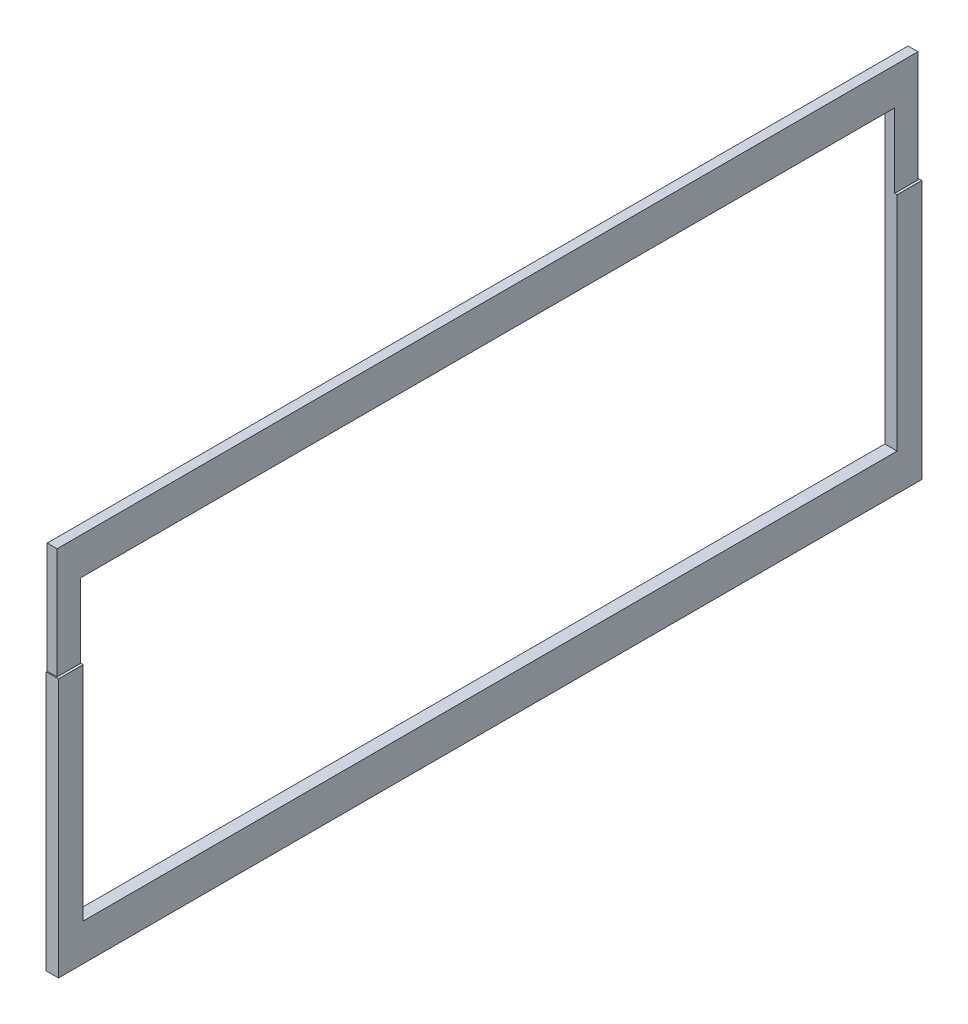
ISO-10303-21;
HEADER;
FILE_DESCRIPTION(('STEP AP214'),'2;1');
FILE_NAME('part.step','',(''),(''),'','','');
FILE_SCHEMA(('AUTOMOTIVE_DESIGN { 1 0 10303 214 1 1 1 1 }'));
ENDSEC;
DATA;
#1=APPLICATION_CONTEXT('core data for automotive mechanical design processes');
#2=APPLICATION_PROTOCOL_DEFINITION('international standard','automotive_design',2000,#1);
#3=PRODUCT_CONTEXT('',#1,'mechanical');
#4=PRODUCT('Part','Part','',(#3));
#5=PRODUCT_RELATED_PRODUCT_CATEGORY('part','',(#4));
#6=PRODUCT_DEFINITION_FORMATION('','',#4);
#7=PRODUCT_DEFINITION_CONTEXT('part definition',#1,'design');
#8=PRODUCT_DEFINITION('design','',#6,#7);
#9=PRODUCT_DEFINITION_SHAPE('','',#8);
#10=(LENGTH_UNIT() NAMED_UNIT(*) SI_UNIT(.MILLI.,.METRE.));
#11=(NAMED_UNIT(*) PLANE_ANGLE_UNIT() SI_UNIT($,.RADIAN.));
#12=(NAMED_UNIT(*) SI_UNIT($,.STERADIAN.) SOLID_ANGLE_UNIT());
#13=UNCERTAINTY_MEASURE_WITH_UNIT(LENGTH_MEASURE(1.E-05),#10,'distance_accuracy_value','');
#14=(GEOMETRIC_REPRESENTATION_CONTEXT(3) GLOBAL_UNCERTAINTY_ASSIGNED_CONTEXT((#13)) GLOBAL_UNIT_ASSIGNED_CONTEXT((#10,
#11,#12)) REPRESENTATION_CONTEXT('',''));
#15=CARTESIAN_POINT('',(0.,0.,0.));
#16=DIRECTION('',(0.,0.,1.));
#17=DIRECTION('',(1.,0.,0.));
#18=AXIS2_PLACEMENT_3D('',#15,#16,#17);
#19=CARTESIAN_POINT('',(10.,-45.,0.));
#20=DIRECTION('',(0.,1.,0.));
#21=DIRECTION('',(0.,0.,1.));
#22=AXIS2_PLACEMENT_3D('',#19,#20,#21);
#23=PLANE('',#22);
#24=DIRECTION('',(1.,0.,0.));
#25=VECTOR('',#24,1.);
#26=CARTESIAN_POINT('',(10.,-45.,329.868447372236));
#27=LINE('',#26,#25);
#28=CARTESIAN_POINT('',(8.,-45.,329.868447372236));
#29=VERTEX_POINT('',#28);
#30=CARTESIAN_POINT('',(10.,-45.,329.868447372236));
#31=VERTEX_POINT('',#30);
#32=EDGE_CURVE('E173',#29,#31,#27,.T.);
#33=ORIENTED_EDGE('',*,*,#32,.F.);
#34=DIRECTION('',(0.,0.,-1.));
#35=VECTOR('',#34,1.);
#36=CARTESIAN_POINT('',(8.,-45.,0.));
#37=LINE('',#36,#35);
#38=CARTESIAN_POINT('',(8.,-45.,349.));
#39=VERTEX_POINT('',#38);
#40=EDGE_CURVE('E176',#39,#29,#37,.T.);
#41=ORIENTED_EDGE('',*,*,#40,.F.);
#42=DIRECTION('',(-1.,0.,0.));
#43=VECTOR('',#42,1.);
#44=CARTESIAN_POINT('',(8.,-45.,349.));
#45=LINE('',#44,#43);
#46=CARTESIAN_POINT('',(0.,-45.,349.));
#47=VERTEX_POINT('',#46);
#48=EDGE_CURVE('E188',#39,#47,#45,.T.);
#49=ORIENTED_EDGE('',*,*,#48,.T.);
#50=DIRECTION('',(0.,0.,-1.));
#51=VECTOR('',#50,1.);
#52=CARTESIAN_POINT('',(0.,-45.,0.));
#53=LINE('',#52,#51);
#54=CARTESIAN_POINT('',(0.,-45.,349.868447372235));
#55=VERTEX_POINT('',#54);
#56=EDGE_CURVE('E239',#55,#47,#53,.T.);
#57=ORIENTED_EDGE('',*,*,#56,.F.);
#58=DIRECTION('',(-1.,0.,0.));
#59=VECTOR('',#58,1.);
#60=CARTESIAN_POINT('',(10.,-45.,349.868447372235));
#61=LINE('',#60,#59);
#62=CARTESIAN_POINT('',(10.,-45.,349.868447372235));
#63=VERTEX_POINT('',#62);
#64=EDGE_CURVE('E262',#63,#55,#61,.T.);
#65=ORIENTED_EDGE('',*,*,#64,.F.);
#66=DIRECTION('',(0.,0.,-1.));
#67=VECTOR('',#66,1.);
#68=CARTESIAN_POINT('',(10.,-45.,0.));
#69=LINE('',#68,#67);
#70=EDGE_CURVE('E230',#63,#31,#69,.T.);
#71=ORIENTED_EDGE('',*,*,#70,.T.);
#72=EDGE_LOOP('',(#33,#41,#49,#57,#65,#71));
#73=FACE_BOUND('',#72,.T.);
#74=ADVANCED_FACE('F33',(#73),#23,.T.);
#75=CARTESIAN_POINT('',(10.,-255.,0.));
#76=DIRECTION('',(0.,1.,0.));
#77=DIRECTION('',(0.,0.,1.));
#78=AXIS2_PLACEMENT_3D('',#75,#76,#77);
#79=PLANE('',#78);
#80=DIRECTION('',(0.,0.,-1.));
#81=VECTOR('',#80,1.);
#82=CARTESIAN_POINT('',(0.,-255.,0.));
#83=LINE('',#82,#81);
#84=CARTESIAN_POINT('',(0.,-255.,349.868447372235));
#85=VERTEX_POINT('',#84);
#86=CARTESIAN_POINT('',(0.,-255.,-350.131552627764));
#87=VERTEX_POINT('',#86);
#88=EDGE_CURVE('E210',#85,#87,#83,.T.);
#89=ORIENTED_EDGE('',*,*,#88,.T.);
#90=DIRECTION('',(-1.,0.,0.));
#91=VECTOR('',#90,1.);
#92=CARTESIAN_POINT('',(10.,-255.,-350.131552627764));
#93=LINE('',#92,#91);
#94=CARTESIAN_POINT('',(10.,-255.,-350.131552627764));
#95=VERTEX_POINT('',#94);
#96=EDGE_CURVE('E215',#95,#87,#93,.T.);
#97=ORIENTED_EDGE('',*,*,#96,.F.);
#98=DIRECTION('',(0.,0.,-1.));
#99=VECTOR('',#98,1.);
#100=CARTESIAN_POINT('',(10.,-255.,0.));
#101=LINE('',#100,#99);
#102=CARTESIAN_POINT('',(10.,-255.,349.868447372235));
#103=VERTEX_POINT('',#102);
#104=EDGE_CURVE('E248',#103,#95,#101,.T.);
#105=ORIENTED_EDGE('',*,*,#104,.F.);
#106=DIRECTION('',(-1.,0.,0.));
#107=VECTOR('',#106,1.);
#108=CARTESIAN_POINT('',(10.,-255.,349.868447372235));
#109=LINE('',#108,#107);
#110=EDGE_CURVE('E260',#103,#85,#109,.T.);
#111=ORIENTED_EDGE('',*,*,#110,.T.);
#112=EDGE_LOOP('',(#89,#97,#105,#111));
#113=FACE_BOUND('',#112,.T.);
#114=ADVANCED_FACE('F35',(#113),#79,.F.);
#115=CARTESIAN_POINT('',(10.,0.,-350.131552627764));
#116=DIRECTION('',(0.,0.,1.));
#117=DIRECTION('',(1.,0.,0.));
#118=AXIS2_PLACEMENT_3D('',#115,#116,#117);
#119=PLANE('',#118);
#120=DIRECTION('',(0.,1.,0.));
#121=VECTOR('',#120,1.);
#122=CARTESIAN_POINT('',(0.,0.,-350.131552627764));
#123=LINE('',#122,#121);
#124=CARTESIAN_POINT('',(0.,-45.,-350.131552627764));
#125=VERTEX_POINT('',#124);
#126=EDGE_CURVE('E250',#87,#125,#123,.T.);
#127=ORIENTED_EDGE('',*,*,#126,.T.);
#128=DIRECTION('',(-1.,0.,0.));
#129=VECTOR('',#128,1.);
#130=CARTESIAN_POINT('',(10.,-45.,-350.131552627764));
#131=LINE('',#130,#129);
#132=CARTESIAN_POINT('',(10.,-45.,-350.131552627764));
#133=VERTEX_POINT('',#132);
#134=EDGE_CURVE('E264',#133,#125,#131,.T.);
#135=ORIENTED_EDGE('',*,*,#134,.F.);
#136=DIRECTION('',(0.,1.,0.));
#137=VECTOR('',#136,1.);
#138=CARTESIAN_POINT('',(10.,0.,-350.131552627764));
#139=LINE('',#138,#137);
#140=EDGE_CURVE('E275',#95,#133,#139,.T.);
#141=ORIENTED_EDGE('',*,*,#140,.F.);
#142=ORIENTED_EDGE('',*,*,#96,.T.);
#143=EDGE_LOOP('',(#127,#135,#141,#142));
#144=FACE_BOUND('',#143,.T.);
#145=ADVANCED_FACE('F274',(#144),#119,.F.);
#146=DIRECTION('',(-1.,0.,0.));
#147=VECTOR('',#146,1.);
#148=CARTESIAN_POINT('',(10.,-45.,-330.131552627764));
#149=LINE('',#148,#147);
#150=CARTESIAN_POINT('',(10.,-45.,-330.131552627764));
#151=VERTEX_POINT('',#150);
#152=CARTESIAN_POINT('',(8.,-45.,-330.131552627764));
#153=VERTEX_POINT('',#152);
#154=EDGE_CURVE('E168',#151,#153,#149,.T.);
#155=ORIENTED_EDGE('',*,*,#154,.F.);
#156=EDGE_CURVE('E157',#151,#133,#69,.T.);
#157=ORIENTED_EDGE('',*,*,#156,.T.);
#158=ORIENTED_EDGE('',*,*,#134,.T.);
#159=CARTESIAN_POINT('',(0.,-45.,-349.));
#160=VERTEX_POINT('',#159);
#161=EDGE_CURVE('E246',#160,#125,#53,.T.);
#162=ORIENTED_EDGE('',*,*,#161,.F.);
#163=DIRECTION('',(-1.,0.,0.));
#164=VECTOR('',#163,1.);
#165=CARTESIAN_POINT('',(8.,-45.,-349.));
#166=LINE('',#165,#164);
#167=CARTESIAN_POINT('',(8.,-45.,-349.));
#168=VERTEX_POINT('',#167);
#169=EDGE_CURVE('E207',#168,#160,#166,.T.);
#170=ORIENTED_EDGE('',*,*,#169,.F.);
#171=EDGE_CURVE('E180',#153,#168,#37,.T.);
#172=ORIENTED_EDGE('',*,*,#171,.F.);
#173=EDGE_LOOP('',(#155,#157,#158,#162,#170,#172));
#174=FACE_BOUND('',#173,.T.);
#175=ADVANCED_FACE('F291',(#174),#23,.T.);
#176=CARTESIAN_POINT('',(10.,0.,349.868447372235));
#177=DIRECTION('',(0.,0.,1.));
#178=DIRECTION('',(1.,0.,0.));
#179=AXIS2_PLACEMENT_3D('',#176,#177,#178);
#180=PLANE('',#179);
#181=DIRECTION('',(0.,1.,0.));
#182=VECTOR('',#181,1.);
#183=CARTESIAN_POINT('',(0.,0.,349.868447372235));
#184=LINE('',#183,#182);
#185=EDGE_CURVE('E245',#85,#55,#184,.T.);
#186=ORIENTED_EDGE('',*,*,#185,.F.);
#187=ORIENTED_EDGE('',*,*,#110,.F.);
#188=DIRECTION('',(0.,1.,0.));
#189=VECTOR('',#188,1.);
#190=CARTESIAN_POINT('',(10.,0.,349.868447372235));
#191=LINE('',#190,#189);
#192=EDGE_CURVE('E263',#103,#63,#191,.T.);
#193=ORIENTED_EDGE('',*,*,#192,.T.);
#194=ORIENTED_EDGE('',*,*,#64,.T.);
#195=EDGE_LOOP('',(#186,#187,#193,#194));
#196=FACE_BOUND('',#195,.T.);
#197=ADVANCED_FACE('F294',(#196),#180,.T.);
#198=CARTESIAN_POINT('',(10.,0.,0.));
#199=DIRECTION('',(1.,0.,0.));
#200=DIRECTION('',(0.,0.,-1.));
#201=AXIS2_PLACEMENT_3D('',#198,#199,#200);
#202=PLANE('',#201);
#203=DIRECTION('',(0.,1.,0.));
#204=VECTOR('',#203,1.);
#205=CARTESIAN_POINT('',(10.,-225.,329.868447372236));
#206=LINE('',#205,#204);
#207=CARTESIAN_POINT('',(10.,-225.,329.868447372236));
#208=VERTEX_POINT('',#207);
#209=EDGE_CURVE('E158',#208,#31,#206,.T.);
#210=ORIENTED_EDGE('',*,*,#209,.T.);
#211=ORIENTED_EDGE('',*,*,#70,.F.);
#212=ORIENTED_EDGE('',*,*,#192,.F.);
#213=ORIENTED_EDGE('',*,*,#104,.T.);
#214=ORIENTED_EDGE('',*,*,#140,.T.);
#215=ORIENTED_EDGE('',*,*,#156,.F.);
#216=DIRECTION('',(0.,-1.,0.));
#217=VECTOR('',#216,1.);
#218=CARTESIAN_POINT('',(10.,-225.,-330.131552627764));
#219=LINE('',#218,#217);
#220=CARTESIAN_POINT('',(10.,-225.,-330.131552627764));
#221=VERTEX_POINT('',#220);
#222=EDGE_CURVE('E137',#151,#221,#219,.T.);
#223=ORIENTED_EDGE('',*,*,#222,.T.);
#224=DIRECTION('',(0.,0.,1.));
#225=VECTOR('',#224,1.);
#226=CARTESIAN_POINT('',(10.,-225.,-330.131552627764));
#227=LINE('',#226,#225);
#228=EDGE_CURVE('E147',#221,#208,#227,.T.);
#229=ORIENTED_EDGE('',*,*,#228,.T.);
#230=EDGE_LOOP('',(#210,#211,#212,#213,#214,#215,#223,#229));
#231=FACE_BOUND('',#230,.T.);
#232=ADVANCED_FACE('F155',(#231),#202,.T.);
#233=CARTESIAN_POINT('',(0.,0.,0.));
#234=DIRECTION('',(1.,0.,0.));
#235=DIRECTION('',(0.,0.,-1.));
#236=AXIS2_PLACEMENT_3D('',#233,#234,#235);
#237=PLANE('',#236);
#238=DIRECTION('',(0.,0.,-1.));
#239=VECTOR('',#238,1.);
#240=CARTESIAN_POINT('',(0.,15.,-330.131552627764));
#241=LINE('',#240,#239);
#242=CARTESIAN_POINT('',(0.,15.,329.868447372236));
#243=VERTEX_POINT('',#242);
#244=CARTESIAN_POINT('',(0.,15.,-330.131552627764));
#245=VERTEX_POINT('',#244);
#246=EDGE_CURVE('E164',#243,#245,#241,.T.);
#247=ORIENTED_EDGE('',*,*,#246,.F.);
#248=DIRECTION('',(0.,1.,0.));
#249=VECTOR('',#248,1.);
#250=CARTESIAN_POINT('',(0.,-225.,329.868447372236));
#251=LINE('',#250,#249);
#252=CARTESIAN_POINT('',(0.,-225.,329.868447372236));
#253=VERTEX_POINT('',#252);
#254=EDGE_CURVE('E48',#253,#243,#251,.T.);
#255=ORIENTED_EDGE('',*,*,#254,.F.);
#256=DIRECTION('',(0.,0.,1.));
#257=VECTOR('',#256,1.);
#258=CARTESIAN_POINT('',(0.,-225.,-330.131552627764));
#259=LINE('',#258,#257);
#260=CARTESIAN_POINT('',(0.,-225.,-330.131552627764));
#261=VERTEX_POINT('',#260);
#262=EDGE_CURVE('E160',#261,#253,#259,.T.);
#263=ORIENTED_EDGE('',*,*,#262,.F.);
#264=DIRECTION('',(0.,-1.,0.));
#265=VECTOR('',#264,1.);
#266=CARTESIAN_POINT('',(0.,-225.,-330.131552627764));
#267=LINE('',#266,#265);
#268=EDGE_CURVE('E140',#245,#261,#267,.T.);
#269=ORIENTED_EDGE('',*,*,#268,.F.);
#270=EDGE_LOOP('',(#247,#255,#263,#269));
#271=FACE_BOUND('',#270,.T.);
#272=ORIENTED_EDGE('',*,*,#88,.F.);
#273=ORIENTED_EDGE('',*,*,#185,.T.);
#274=ORIENTED_EDGE('',*,*,#56,.T.);
#275=DIRECTION('',(0.,1.,0.));
#276=VECTOR('',#275,1.);
#277=CARTESIAN_POINT('',(0.,0.,349.));
#278=LINE('',#277,#276);
#279=CARTESIAN_POINT('',(0.,45.,349.));
#280=VERTEX_POINT('',#279);
#281=EDGE_CURVE('E192',#47,#280,#278,.T.);
#282=ORIENTED_EDGE('',*,*,#281,.T.);
#283=DIRECTION('',(0.,0.,-1.));
#284=VECTOR('',#283,1.);
#285=CARTESIAN_POINT('',(0.,45.,0.));
#286=LINE('',#285,#284);
#287=CARTESIAN_POINT('',(0.,45.,-349.));
#288=VERTEX_POINT('',#287);
#289=EDGE_CURVE('E189',#280,#288,#286,.T.);
#290=ORIENTED_EDGE('',*,*,#289,.T.);
#291=DIRECTION('',(0.,1.,0.));
#292=VECTOR('',#291,1.);
#293=CARTESIAN_POINT('',(0.,0.,-349.));
#294=LINE('',#293,#292);
#295=EDGE_CURVE('E175',#160,#288,#294,.T.);
#296=ORIENTED_EDGE('',*,*,#295,.F.);
#297=ORIENTED_EDGE('',*,*,#161,.T.);
#298=ORIENTED_EDGE('',*,*,#126,.F.);
#299=EDGE_LOOP('',(#272,#273,#274,#282,#290,#296,#297,#298));
#300=FACE_BOUND('',#299,.T.);
#301=ADVANCED_FACE('F243',(#271,#300),#237,.F.);
#302=CARTESIAN_POINT('',(8.,0.,-349.));
#303=DIRECTION('',(0.,0.,1.));
#304=DIRECTION('',(1.,0.,0.));
#305=AXIS2_PLACEMENT_3D('',#302,#303,#304);
#306=PLANE('',#305);
#307=ORIENTED_EDGE('',*,*,#295,.T.);
#308=DIRECTION('',(-1.,0.,0.));
#309=VECTOR('',#308,1.);
#310=CARTESIAN_POINT('',(8.,45.,-349.));
#311=LINE('',#310,#309);
#312=CARTESIAN_POINT('',(8.,45.,-349.));
#313=VERTEX_POINT('',#312);
#314=EDGE_CURVE('E211',#313,#288,#311,.T.);
#315=ORIENTED_EDGE('',*,*,#314,.F.);
#316=DIRECTION('',(0.,1.,0.));
#317=VECTOR('',#316,1.);
#318=CARTESIAN_POINT('',(8.,0.,-349.));
#319=LINE('',#318,#317);
#320=EDGE_CURVE('E179',#168,#313,#319,.T.);
#321=ORIENTED_EDGE('',*,*,#320,.F.);
#322=ORIENTED_EDGE('',*,*,#169,.T.);
#323=EDGE_LOOP('',(#307,#315,#321,#322));
#324=FACE_BOUND('',#323,.T.);
#325=ADVANCED_FACE('F289',(#324),#306,.F.);
#326=CARTESIAN_POINT('',(8.,45.,0.));
#327=DIRECTION('',(0.,1.,0.));
#328=DIRECTION('',(0.,0.,1.));
#329=AXIS2_PLACEMENT_3D('',#326,#327,#328);
#330=PLANE('',#329);
#331=ORIENTED_EDGE('',*,*,#289,.F.);
#332=DIRECTION('',(-1.,0.,0.));
#333=VECTOR('',#332,1.);
#334=CARTESIAN_POINT('',(8.,45.,349.));
#335=LINE('',#334,#333);
#336=CARTESIAN_POINT('',(8.,45.,349.));
#337=VERTEX_POINT('',#336);
#338=EDGE_CURVE('E195',#337,#280,#335,.T.);
#339=ORIENTED_EDGE('',*,*,#338,.F.);
#340=DIRECTION('',(0.,0.,-1.));
#341=VECTOR('',#340,1.);
#342=CARTESIAN_POINT('',(8.,45.,0.));
#343=LINE('',#342,#341);
#344=EDGE_CURVE('E182',#337,#313,#343,.T.);
#345=ORIENTED_EDGE('',*,*,#344,.T.);
#346=ORIENTED_EDGE('',*,*,#314,.T.);
#347=EDGE_LOOP('',(#331,#339,#345,#346));
#348=FACE_BOUND('',#347,.T.);
#349=ADVANCED_FACE('F286',(#348),#330,.T.);
#350=CARTESIAN_POINT('',(8.,0.,349.));
#351=DIRECTION('',(0.,0.,1.));
#352=DIRECTION('',(1.,0.,0.));
#353=AXIS2_PLACEMENT_3D('',#350,#351,#352);
#354=PLANE('',#353);
#355=ORIENTED_EDGE('',*,*,#281,.F.);
#356=ORIENTED_EDGE('',*,*,#48,.F.);
#357=DIRECTION('',(0.,1.,0.));
#358=VECTOR('',#357,1.);
#359=CARTESIAN_POINT('',(8.,0.,349.));
#360=LINE('',#359,#358);
#361=EDGE_CURVE('E185',#39,#337,#360,.T.);
#362=ORIENTED_EDGE('',*,*,#361,.T.);
#363=ORIENTED_EDGE('',*,*,#338,.T.);
#364=EDGE_LOOP('',(#355,#356,#362,#363));
#365=FACE_BOUND('',#364,.T.);
#366=ADVANCED_FACE('F234',(#365),#354,.T.);
#367=CARTESIAN_POINT('',(8.,0.,0.));
#368=DIRECTION('',(1.,0.,0.));
#369=DIRECTION('',(0.,0.,-1.));
#370=AXIS2_PLACEMENT_3D('',#367,#368,#369);
#371=PLANE('',#370);
#372=DIRECTION('',(0.,-1.,0.));
#373=VECTOR('',#372,1.);
#374=CARTESIAN_POINT('',(8.,0.,329.868447372236));
#375=LINE('',#374,#373);
#376=CARTESIAN_POINT('',(8.,15.,329.868447372236));
#377=VERTEX_POINT('',#376);
#378=EDGE_CURVE('E11',#377,#29,#375,.T.);
#379=ORIENTED_EDGE('',*,*,#378,.F.);
#380=DIRECTION('',(0.,0.,1.));
#381=VECTOR('',#380,1.);
#382=CARTESIAN_POINT('',(8.,15.,0.));
#383=LINE('',#382,#381);
#384=CARTESIAN_POINT('',(8.,15.,-330.131552627764));
#385=VERTEX_POINT('',#384);
#386=EDGE_CURVE('E214',#385,#377,#383,.T.);
#387=ORIENTED_EDGE('',*,*,#386,.F.);
#388=DIRECTION('',(0.,1.,0.));
#389=VECTOR('',#388,1.);
#390=CARTESIAN_POINT('',(8.,0.,-330.131552627764));
#391=LINE('',#390,#389);
#392=EDGE_CURVE('E41',#153,#385,#391,.T.);
#393=ORIENTED_EDGE('',*,*,#392,.F.);
#394=ORIENTED_EDGE('',*,*,#171,.T.);
#395=ORIENTED_EDGE('',*,*,#320,.T.);
#396=ORIENTED_EDGE('',*,*,#344,.F.);
#397=ORIENTED_EDGE('',*,*,#361,.F.);
#398=ORIENTED_EDGE('',*,*,#40,.T.);
#399=EDGE_LOOP('',(#379,#387,#393,#394,#395,#396,#397,#398));
#400=FACE_BOUND('',#399,.T.);
#401=ADVANCED_FACE('F221',(#400),#371,.T.);
#402=CARTESIAN_POINT('',(10.,-225.,329.868447372236));
#403=DIRECTION('',(0.,0.,1.));
#404=DIRECTION('',(1.,0.,0.));
#405=AXIS2_PLACEMENT_3D('',#402,#403,#404);
#406=PLANE('',#405);
#407=ORIENTED_EDGE('',*,*,#32,.T.);
#408=ORIENTED_EDGE('',*,*,#209,.F.);
#409=DIRECTION('',(-1.,0.,0.));
#410=VECTOR('',#409,1.);
#411=CARTESIAN_POINT('',(10.,-225.,329.868447372236));
#412=LINE('',#411,#410);
#413=EDGE_CURVE('E144',#208,#253,#412,.T.);
#414=ORIENTED_EDGE('',*,*,#413,.T.);
#415=ORIENTED_EDGE('',*,*,#254,.T.);
#416=DIRECTION('',(-1.,0.,0.));
#417=VECTOR('',#416,1.);
#418=CARTESIAN_POINT('',(10.,15.,329.868447372236));
#419=LINE('',#418,#417);
#420=EDGE_CURVE('E152',#377,#243,#419,.T.);
#421=ORIENTED_EDGE('',*,*,#420,.F.);
#422=ORIENTED_EDGE('',*,*,#378,.T.);
#423=EDGE_LOOP('',(#407,#408,#414,#415,#421,#422));
#424=FACE_BOUND('',#423,.T.);
#425=ADVANCED_FACE('F224',(#424),#406,.F.);
#426=CARTESIAN_POINT('',(10.,-225.,-330.131552627764));
#427=DIRECTION('',(0.,-1.,0.));
#428=DIRECTION('',(0.,0.,-1.));
#429=AXIS2_PLACEMENT_3D('',#426,#427,#428);
#430=PLANE('',#429);
#431=ORIENTED_EDGE('',*,*,#262,.T.);
#432=ORIENTED_EDGE('',*,*,#413,.F.);
#433=ORIENTED_EDGE('',*,*,#228,.F.);
#434=DIRECTION('',(-1.,0.,0.));
#435=VECTOR('',#434,1.);
#436=CARTESIAN_POINT('',(10.,-225.,-330.131552627764));
#437=LINE('',#436,#435);
#438=EDGE_CURVE('E133',#221,#261,#437,.T.);
#439=ORIENTED_EDGE('',*,*,#438,.T.);
#440=EDGE_LOOP('',(#431,#432,#433,#439));
#441=FACE_BOUND('',#440,.T.);
#442=ADVANCED_FACE('F148',(#441),#430,.F.);
#443=CARTESIAN_POINT('',(10.,-225.,-330.131552627764));
#444=DIRECTION('',(0.,0.,-1.));
#445=DIRECTION('',(-1.,0.,0.));
#446=AXIS2_PLACEMENT_3D('',#443,#444,#445);
#447=PLANE('',#446);
#448=ORIENTED_EDGE('',*,*,#154,.T.);
#449=ORIENTED_EDGE('',*,*,#392,.T.);
#450=DIRECTION('',(-1.,0.,0.));
#451=VECTOR('',#450,1.);
#452=CARTESIAN_POINT('',(10.,15.,-330.131552627764));
#453=LINE('',#452,#451);
#454=EDGE_CURVE('E56',#385,#245,#453,.T.);
#455=ORIENTED_EDGE('',*,*,#454,.T.);
#456=ORIENTED_EDGE('',*,*,#268,.T.);
#457=ORIENTED_EDGE('',*,*,#438,.F.);
#458=ORIENTED_EDGE('',*,*,#222,.F.);
#459=EDGE_LOOP('',(#448,#449,#455,#456,#457,#458));
#460=FACE_BOUND('',#459,.T.);
#461=ADVANCED_FACE('F135',(#460),#447,.F.);
#462=CARTESIAN_POINT('',(10.,15.,-330.131552627764));
#463=DIRECTION('',(0.,1.,0.));
#464=DIRECTION('',(0.,0.,1.));
#465=AXIS2_PLACEMENT_3D('',#462,#463,#464);
#466=PLANE('',#465);
#467=ORIENTED_EDGE('',*,*,#386,.T.);
#468=ORIENTED_EDGE('',*,*,#420,.T.);
#469=ORIENTED_EDGE('',*,*,#246,.T.);
#470=ORIENTED_EDGE('',*,*,#454,.F.);
#471=EDGE_LOOP('',(#467,#468,#469,#470));
#472=FACE_BOUND('',#471,.T.);
#473=ADVANCED_FACE('F222',(#472),#466,.F.);
#474=CLOSED_SHELL('',(#74,#114,#145,#175,#197,#232,#301,#325,#349,#366,#401,#425,#442,#461,#473));
#475=MANIFOLD_SOLID_BREP('B2',#474);
#476=ADVANCED_BREP_SHAPE_REPRESENTATION('',(#18,#475),#14);
#477=SHAPE_DEFINITION_REPRESENTATION(#9,#476);
ENDSEC;
END-ISO-10303-21;
